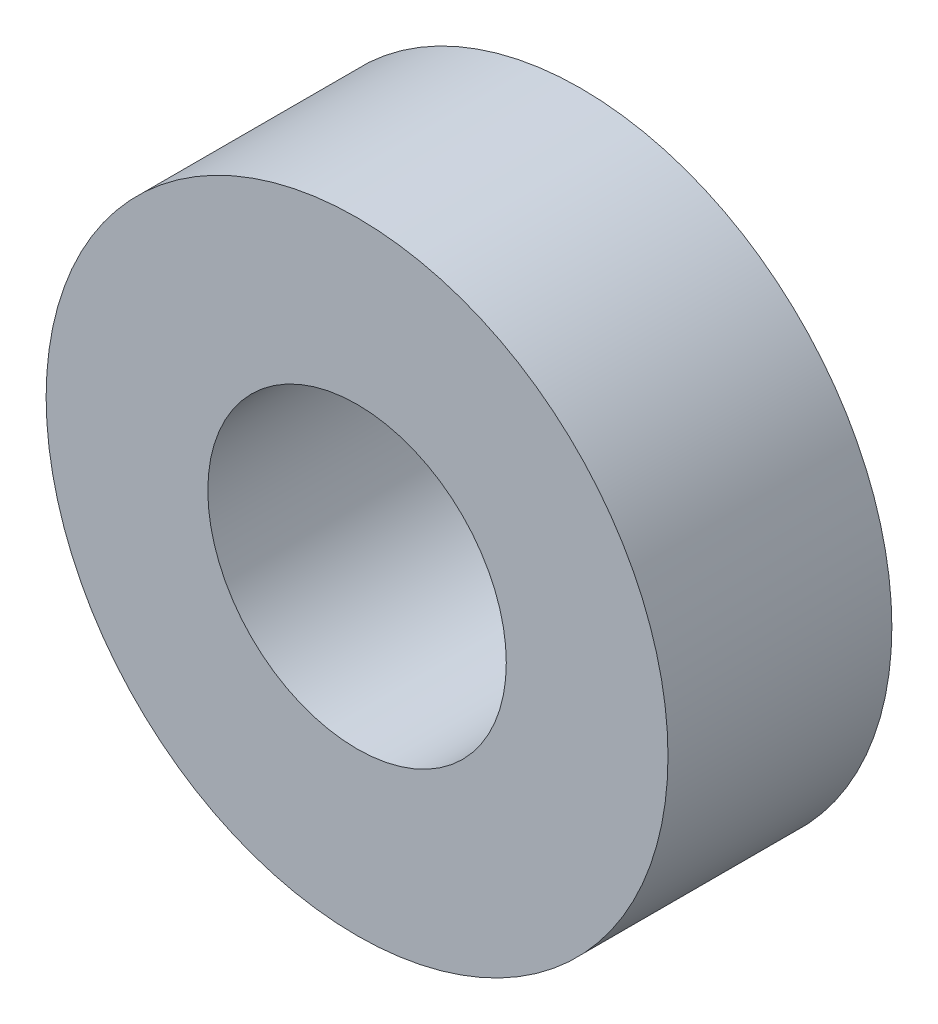
ISO-10303-21;
HEADER;
FILE_DESCRIPTION(('STEP AP214'),'2;1');
FILE_NAME('part.step','',(''),(''),'','','');
FILE_SCHEMA(('AUTOMOTIVE_DESIGN { 1 0 10303 214 1 1 1 1 }'));
ENDSEC;
DATA;
#1=APPLICATION_CONTEXT('core data for automotive mechanical design processes');
#2=APPLICATION_PROTOCOL_DEFINITION('international standard','automotive_design',2000,#1);
#3=PRODUCT_CONTEXT('',#1,'mechanical');
#4=PRODUCT('Part','Part','',(#3));
#5=PRODUCT_RELATED_PRODUCT_CATEGORY('part','',(#4));
#6=PRODUCT_DEFINITION_FORMATION('','',#4);
#7=PRODUCT_DEFINITION_CONTEXT('part definition',#1,'design');
#8=PRODUCT_DEFINITION('design','',#6,#7);
#9=PRODUCT_DEFINITION_SHAPE('','',#8);
#10=(LENGTH_UNIT() NAMED_UNIT(*) SI_UNIT(.MILLI.,.METRE.));
#11=(NAMED_UNIT(*) PLANE_ANGLE_UNIT() SI_UNIT($,.RADIAN.));
#12=(NAMED_UNIT(*) SI_UNIT($,.STERADIAN.) SOLID_ANGLE_UNIT());
#13=UNCERTAINTY_MEASURE_WITH_UNIT(LENGTH_MEASURE(1.E-05),#10,'distance_accuracy_value','');
#14=(GEOMETRIC_REPRESENTATION_CONTEXT(3) GLOBAL_UNCERTAINTY_ASSIGNED_CONTEXT((#13)) GLOBAL_UNIT_ASSIGNED_CONTEXT((#10,
#11,#12)) REPRESENTATION_CONTEXT('',''));
#15=CARTESIAN_POINT('',(0.,0.,0.));
#16=DIRECTION('',(0.,0.,1.));
#17=DIRECTION('',(1.,0.,0.));
#18=AXIS2_PLACEMENT_3D('',#15,#16,#17);
#19=CARTESIAN_POINT('',(0.,0.,4.5));
#20=DIRECTION('',(0.,0.,1.));
#21=DIRECTION('',(1.,0.,0.));
#22=AXIS2_PLACEMENT_3D('',#19,#20,#21);
#23=PLANE('',#22);
#24=CARTESIAN_POINT('',(0.,0.,4.5));
#25=DIRECTION('',(0.,0.,1.));
#26=DIRECTION('',(1.,0.,0.));
#27=AXIS2_PLACEMENT_3D('',#24,#25,#26);
#28=CIRCLE('',#27,6.25);
#29=CARTESIAN_POINT('',(6.25,0.,4.5));
#30=VERTEX_POINT('',#29);
#31=EDGE_CURVE('E10',#30,#30,#28,.T.);
#32=ORIENTED_EDGE('',*,*,#31,.T.);
#33=EDGE_LOOP('',(#32));
#34=FACE_BOUND('',#33,.T.);
#35=CARTESIAN_POINT('',(0.,0.,4.5));
#36=DIRECTION('',(0.,0.,1.));
#37=DIRECTION('',(1.,0.,0.));
#38=AXIS2_PLACEMENT_3D('',#35,#36,#37);
#39=CIRCLE('',#38,3.);
#40=CARTESIAN_POINT('',(3.,0.,4.5));
#41=VERTEX_POINT('',#40);
#42=EDGE_CURVE('E26',#41,#41,#39,.T.);
#43=ORIENTED_EDGE('',*,*,#42,.F.);
#44=EDGE_LOOP('',(#43));
#45=FACE_BOUND('',#44,.T.);
#46=ADVANCED_FACE('F15',(#34,#45),#23,.T.);
#47=CARTESIAN_POINT('',(0.,0.,0.));
#48=DIRECTION('',(0.,0.,1.));
#49=DIRECTION('',(1.,0.,0.));
#50=AXIS2_PLACEMENT_3D('',#47,#48,#49);
#51=PLANE('',#50);
#52=CARTESIAN_POINT('',(0.,0.,0.));
#53=DIRECTION('',(0.,0.,1.));
#54=DIRECTION('',(1.,0.,0.));
#55=AXIS2_PLACEMENT_3D('',#52,#53,#54);
#56=CIRCLE('',#55,6.25);
#57=CARTESIAN_POINT('',(6.25,0.,0.));
#58=VERTEX_POINT('',#57);
#59=EDGE_CURVE('E19',#58,#58,#56,.T.);
#60=ORIENTED_EDGE('',*,*,#59,.F.);
#61=EDGE_LOOP('',(#60));
#62=FACE_BOUND('',#61,.T.);
#63=CARTESIAN_POINT('',(0.,0.,0.));
#64=DIRECTION('',(0.,0.,1.));
#65=DIRECTION('',(1.,0.,0.));
#66=AXIS2_PLACEMENT_3D('',#63,#64,#65);
#67=CIRCLE('',#66,3.);
#68=CARTESIAN_POINT('',(3.,0.,0.));
#69=VERTEX_POINT('',#68);
#70=EDGE_CURVE('E28',#69,#69,#67,.T.);
#71=ORIENTED_EDGE('',*,*,#70,.T.);
#72=EDGE_LOOP('',(#71));
#73=FACE_BOUND('',#72,.T.);
#74=ADVANCED_FACE('F38',(#62,#73),#51,.F.);
#75=CARTESIAN_POINT('',(0.,0.,4.5));
#76=DIRECTION('',(0.,0.,-1.));
#77=DIRECTION('',(-1.,0.,0.));
#78=AXIS2_PLACEMENT_3D('',#75,#76,#77);
#79=CYLINDRICAL_SURFACE('',#78,6.25);
#80=ORIENTED_EDGE('',*,*,#31,.F.);
#81=EDGE_LOOP('',(#80));
#82=FACE_BOUND('',#81,.T.);
#83=ORIENTED_EDGE('',*,*,#59,.T.);
#84=EDGE_LOOP('',(#83));
#85=FACE_BOUND('',#84,.T.);
#86=ADVANCED_FACE('F17',(#82,#85),#79,.T.);
#87=CARTESIAN_POINT('',(0.,0.,4.5));
#88=DIRECTION('',(0.,0.,-1.));
#89=DIRECTION('',(-1.,0.,0.));
#90=AXIS2_PLACEMENT_3D('',#87,#88,#89);
#91=CYLINDRICAL_SURFACE('',#90,3.);
#92=ORIENTED_EDGE('',*,*,#42,.T.);
#93=EDGE_LOOP('',(#92));
#94=FACE_BOUND('',#93,.T.);
#95=ORIENTED_EDGE('',*,*,#70,.F.);
#96=EDGE_LOOP('',(#95));
#97=FACE_BOUND('',#96,.T.);
#98=ADVANCED_FACE('F34',(#94,#97),#91,.F.);
#99=CLOSED_SHELL('',(#46,#74,#86,#98));
#100=MANIFOLD_SOLID_BREP('B1',#99);
#101=ADVANCED_BREP_SHAPE_REPRESENTATION('',(#18,#100),#14);
#102=SHAPE_DEFINITION_REPRESENTATION(#9,#101);
ENDSEC;
END-ISO-10303-21;
